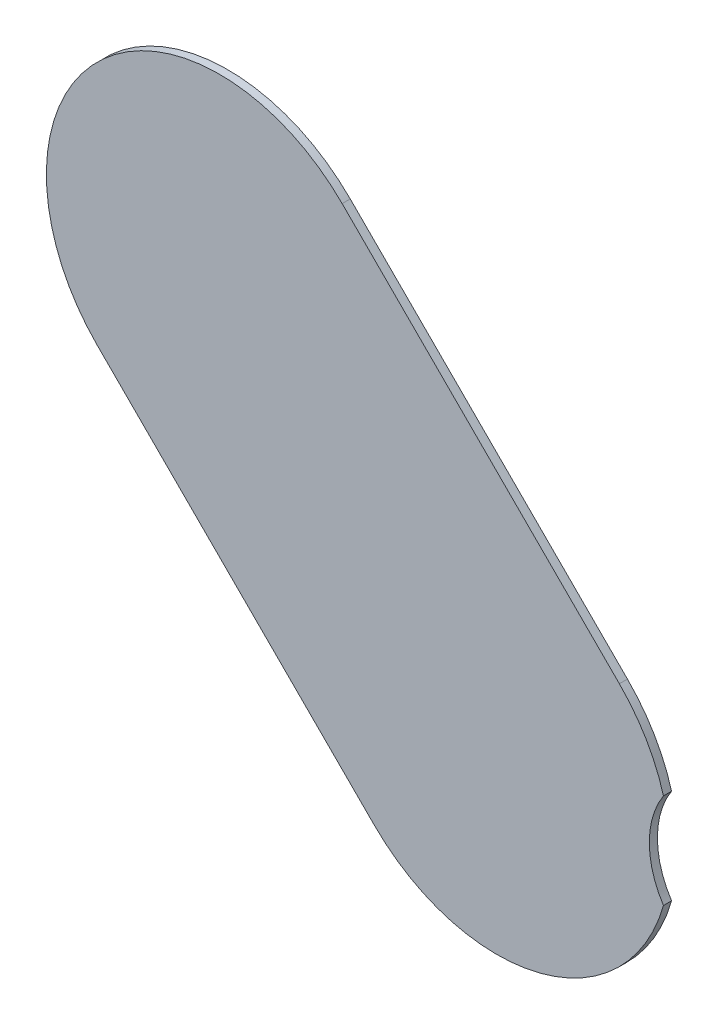
ISO-10303-21;
HEADER;
FILE_DESCRIPTION(('STEP AP214'),'2;1');
FILE_NAME('part.step','',(''),(''),'','','');
FILE_SCHEMA(('AUTOMOTIVE_DESIGN { 1 0 10303 214 1 1 1 1 }'));
ENDSEC;
DATA;
#1=APPLICATION_CONTEXT('core data for automotive mechanical design processes');
#2=APPLICATION_PROTOCOL_DEFINITION('international standard','automotive_design',2000,#1);
#3=PRODUCT_CONTEXT('',#1,'mechanical');
#4=PRODUCT('Part','Part','',(#3));
#5=PRODUCT_RELATED_PRODUCT_CATEGORY('part','',(#4));
#6=PRODUCT_DEFINITION_FORMATION('','',#4);
#7=PRODUCT_DEFINITION_CONTEXT('part definition',#1,'design');
#8=PRODUCT_DEFINITION('design','',#6,#7);
#9=PRODUCT_DEFINITION_SHAPE('','',#8);
#10=(LENGTH_UNIT() NAMED_UNIT(*) SI_UNIT(.MILLI.,.METRE.));
#11=(NAMED_UNIT(*) PLANE_ANGLE_UNIT() SI_UNIT($,.RADIAN.));
#12=(NAMED_UNIT(*) SI_UNIT($,.STERADIAN.) SOLID_ANGLE_UNIT());
#13=UNCERTAINTY_MEASURE_WITH_UNIT(LENGTH_MEASURE(1.E-05),#10,'distance_accuracy_value','');
#14=(GEOMETRIC_REPRESENTATION_CONTEXT(3) GLOBAL_UNCERTAINTY_ASSIGNED_CONTEXT((#13)) GLOBAL_UNIT_ASSIGNED_CONTEXT((#10,
#11,#12)) REPRESENTATION_CONTEXT('',''));
#15=CARTESIAN_POINT('',(0.,0.,0.));
#16=DIRECTION('',(0.,0.,1.));
#17=DIRECTION('',(1.,0.,0.));
#18=AXIS2_PLACEMENT_3D('',#15,#16,#17);
#19=CARTESIAN_POINT('',(20.4499995,-3.4499995,1.6));
#20=DIRECTION('',(0.,0.,-1.));
#21=DIRECTION('',(-0.707106781186548,-0.707106781186548,0.));
#22=AXIS2_PLACEMENT_3D('',#19,#20,#21);
#23=CYLINDRICAL_SURFACE('',#22,0.75000058564);
#24=DIRECTION('',(0.,0.,-1.));
#25=VECTOR('',#24,1.);
#26=CARTESIAN_POINT('',(21.171304324483,-3.655475115676,1.6));
#27=LINE('',#26,#25);
#28=CARTESIAN_POINT('',(21.171304324483,-3.655475115676,1.635));
#29=VERTEX_POINT('',#28);
#30=CARTESIAN_POINT('',(21.171304324483,-3.655475115676,1.6));
#31=VERTEX_POINT('',#30);
#32=EDGE_CURVE('E25',#29,#31,#27,.T.);
#33=ORIENTED_EDGE('',*,*,#32,.F.);
#34=CARTESIAN_POINT('',(20.4499995,-3.4499995,1.635));
#35=DIRECTION('',(0.,0.,1.));
#36=DIRECTION('',(-0.707106781186548,-0.707106781186548,0.));
#37=AXIS2_PLACEMENT_3D('',#34,#35,#36);
#38=CIRCLE('',#37,0.75000058564);
#39=CARTESIAN_POINT('',(19.919669,-3.98033,1.635));
#40=VERTEX_POINT('',#39);
#41=EDGE_CURVE('E142',#40,#29,#38,.T.);
#42=ORIENTED_EDGE('',*,*,#41,.F.);
#43=DIRECTION('',(0.,0.,1.));
#44=VECTOR('',#43,1.);
#45=CARTESIAN_POINT('',(19.919669,-3.98033,1.6));
#46=LINE('',#45,#44);
#47=CARTESIAN_POINT('',(19.919669,-3.98033,1.6));
#48=VERTEX_POINT('',#47);
#49=EDGE_CURVE('E11',#48,#40,#46,.T.);
#50=ORIENTED_EDGE('',*,*,#49,.F.);
#51=CARTESIAN_POINT('',(20.4499995,-3.4499995,1.6));
#52=DIRECTION('',(0.,0.,1.));
#53=DIRECTION('',(-0.707106781186548,-0.707106781186548,0.));
#54=AXIS2_PLACEMENT_3D('',#51,#52,#53);
#55=CIRCLE('',#54,0.75000058564);
#56=EDGE_CURVE('E144',#48,#31,#55,.T.);
#57=ORIENTED_EDGE('',*,*,#56,.T.);
#58=EDGE_LOOP('',(#33,#42,#50,#57));
#59=FACE_BOUND('',#58,.T.);
#60=ADVANCED_FACE('F16',(#59),#23,.T.);
#61=CARTESIAN_POINT('',(18.719669,-2.78033,1.6));
#62=DIRECTION('',(0.707106781186548,0.707106781186548,0.));
#63=DIRECTION('',(0.,0.,-1.));
#64=AXIS2_PLACEMENT_3D('',#61,#62,#63);
#65=PLANE('',#64);
#66=DIRECTION('',(0.707106781186548,-0.707106781186548,0.));
#67=VECTOR('',#66,1.);
#68=CARTESIAN_POINT('',(18.719669,-2.78033,1.6));
#69=LINE('',#68,#67);
#70=CARTESIAN_POINT('',(18.719669,-2.78033,1.6));
#71=VERTEX_POINT('',#70);
#72=EDGE_CURVE('E143',#71,#48,#69,.T.);
#73=ORIENTED_EDGE('',*,*,#72,.T.);
#74=ORIENTED_EDGE('',*,*,#49,.T.);
#75=DIRECTION('',(0.707106781186548,-0.707106781186548,0.));
#76=VECTOR('',#75,1.);
#77=CARTESIAN_POINT('',(18.719669,-2.78033,1.635));
#78=LINE('',#77,#76);
#79=CARTESIAN_POINT('',(18.719669,-2.78033,1.635));
#80=VERTEX_POINT('',#79);
#81=EDGE_CURVE('E139',#80,#40,#78,.T.);
#82=ORIENTED_EDGE('',*,*,#81,.F.);
#83=DIRECTION('',(0.,0.,1.));
#84=VECTOR('',#83,1.);
#85=CARTESIAN_POINT('',(18.719669,-2.78033,1.6));
#86=LINE('',#85,#84);
#87=EDGE_CURVE('E104',#71,#80,#86,.T.);
#88=ORIENTED_EDGE('',*,*,#87,.F.);
#89=EDGE_LOOP('',(#73,#74,#82,#88));
#90=FACE_BOUND('',#89,.T.);
#91=ADVANCED_FACE('F271',(#90),#65,.F.);
#92=CARTESIAN_POINT('',(21.485,-3.45,-0.045));
#93=DIRECTION('',(0.,0.,-1.));
#94=DIRECTION('',(0.,-1.,0.));
#95=AXIS2_PLACEMENT_3D('',#92,#93,#94);
#96=CYLINDRICAL_SURFACE('',#95,0.375);
#97=DIRECTION('',(0.,0.,-1.));
#98=VECTOR('',#97,1.);
#99=CARTESIAN_POINT('',(21.17130452301,-3.244524581236,1.6));
#100=LINE('',#99,#98);
#101=CARTESIAN_POINT('',(21.17130452301,-3.244524581237,1.635));
#102=VERTEX_POINT('',#101);
#103=CARTESIAN_POINT('',(21.17130452301,-3.244524581237,1.6));
#104=VERTEX_POINT('',#103);
#105=EDGE_CURVE('E132',#102,#104,#100,.T.);
#106=ORIENTED_EDGE('',*,*,#105,.F.);
#107=CARTESIAN_POINT('',(21.485,-3.45,1.635));
#108=DIRECTION('',(0.,0.,-1.));
#109=DIRECTION('',(0.,-1.,0.));
#110=AXIS2_PLACEMENT_3D('',#107,#108,#109);
#111=CIRCLE('',#110,0.375);
#112=EDGE_CURVE('E83',#29,#102,#111,.T.);
#113=ORIENTED_EDGE('',*,*,#112,.F.);
#114=ORIENTED_EDGE('',*,*,#32,.T.);
#115=CARTESIAN_POINT('',(21.485,-3.45,1.6));
#116=DIRECTION('',(0.,0.,-1.));
#117=DIRECTION('',(0.,-1.,0.));
#118=AXIS2_PLACEMENT_3D('',#115,#116,#117);
#119=CIRCLE('',#118,0.375);
#120=EDGE_CURVE('E70',#31,#104,#119,.T.);
#121=ORIENTED_EDGE('',*,*,#120,.T.);
#122=EDGE_LOOP('',(#106,#113,#114,#121));
#123=FACE_BOUND('',#122,.T.);
#124=ADVANCED_FACE('F262',(#123),#96,.F.);
#125=CARTESIAN_POINT('',(20.98033,-2.919669,1.635));
#126=DIRECTION('',(0.,0.,1.));
#127=DIRECTION('',(1.,0.,0.));
#128=AXIS2_PLACEMENT_3D('',#125,#126,#127);
#129=PLANE('',#128);
#130=CARTESIAN_POINT('',(20.4499995,-3.4499995,1.635));
#131=DIRECTION('',(0.,0.,1.));
#132=DIRECTION('',(-0.707106781186548,-0.707106781186548,0.));
#133=AXIS2_PLACEMENT_3D('',#130,#131,#132);
#134=CIRCLE('',#133,0.75000058564);
#135=CARTESIAN_POINT('',(20.98033,-2.919669,1.635));
#136=VERTEX_POINT('',#135);
#137=EDGE_CURVE('E112',#102,#136,#134,.T.);
#138=ORIENTED_EDGE('',*,*,#137,.T.);
#139=DIRECTION('',(-0.707106781186548,0.707106781186548,0.));
#140=VECTOR('',#139,1.);
#141=CARTESIAN_POINT('',(20.98033,-2.919669,1.635));
#142=LINE('',#141,#140);
#143=CARTESIAN_POINT('',(19.78033,-1.719669,1.635));
#144=VERTEX_POINT('',#143);
#145=EDGE_CURVE('E109',#136,#144,#142,.T.);
#146=ORIENTED_EDGE('',*,*,#145,.T.);
#147=CARTESIAN_POINT('',(19.2499995,-2.2499995,1.635));
#148=DIRECTION('',(0.,0.,1.));
#149=DIRECTION('',(0.707106781186548,0.707106781186548,0.));
#150=AXIS2_PLACEMENT_3D('',#147,#148,#149);
#151=CIRCLE('',#150,0.75000058564);
#152=EDGE_CURVE('E96',#144,#80,#151,.T.);
#153=ORIENTED_EDGE('',*,*,#152,.T.);
#154=ORIENTED_EDGE('',*,*,#81,.T.);
#155=ORIENTED_EDGE('',*,*,#41,.T.);
#156=ORIENTED_EDGE('',*,*,#112,.T.);
#157=EDGE_LOOP('',(#138,#146,#153,#154,#155,#156));
#158=FACE_BOUND('',#157,.T.);
#159=ADVANCED_FACE('F110',(#158),#129,.T.);
#160=CARTESIAN_POINT('',(20.98033,-2.919669,1.6));
#161=DIRECTION('',(0.,0.,1.));
#162=DIRECTION('',(1.,0.,0.));
#163=AXIS2_PLACEMENT_3D('',#160,#161,#162);
#164=PLANE('',#163);
#165=ORIENTED_EDGE('',*,*,#120,.F.);
#166=ORIENTED_EDGE('',*,*,#56,.F.);
#167=ORIENTED_EDGE('',*,*,#72,.F.);
#168=CARTESIAN_POINT('',(19.2499995,-2.2499995,1.6));
#169=DIRECTION('',(0.,0.,1.));
#170=DIRECTION('',(0.707106781186548,0.707106781186548,0.));
#171=AXIS2_PLACEMENT_3D('',#168,#169,#170);
#172=CIRCLE('',#171,0.75000058564);
#173=CARTESIAN_POINT('',(19.78033,-1.719669,1.6));
#174=VERTEX_POINT('',#173);
#175=EDGE_CURVE('E136',#174,#71,#172,.T.);
#176=ORIENTED_EDGE('',*,*,#175,.F.);
#177=DIRECTION('',(-0.707106781186548,0.707106781186548,0.));
#178=VECTOR('',#177,1.);
#179=CARTESIAN_POINT('',(20.98033,-2.919669,1.6));
#180=LINE('',#179,#178);
#181=CARTESIAN_POINT('',(20.98033,-2.919669,1.6));
#182=VERTEX_POINT('',#181);
#183=EDGE_CURVE('E121',#182,#174,#180,.T.);
#184=ORIENTED_EDGE('',*,*,#183,.F.);
#185=CARTESIAN_POINT('',(20.4499995,-3.4499995,1.6));
#186=DIRECTION('',(0.,0.,1.));
#187=DIRECTION('',(-0.707106781186548,-0.707106781186548,0.));
#188=AXIS2_PLACEMENT_3D('',#185,#186,#187);
#189=CIRCLE('',#188,0.75000058564);
#190=EDGE_CURVE('E19',#104,#182,#189,.T.);
#191=ORIENTED_EDGE('',*,*,#190,.F.);
#192=EDGE_LOOP('',(#165,#166,#167,#176,#184,#191));
#193=FACE_BOUND('',#192,.T.);
#194=ADVANCED_FACE('F243',(#193),#164,.F.);
#195=CARTESIAN_POINT('',(19.2499995,-2.2499995,1.6));
#196=DIRECTION('',(0.,0.,-1.));
#197=DIRECTION('',(0.707106781186548,0.707106781186548,0.));
#198=AXIS2_PLACEMENT_3D('',#195,#196,#197);
#199=CYLINDRICAL_SURFACE('',#198,0.75000058564);
#200=ORIENTED_EDGE('',*,*,#175,.T.);
#201=ORIENTED_EDGE('',*,*,#87,.T.);
#202=ORIENTED_EDGE('',*,*,#152,.F.);
#203=DIRECTION('',(0.,0.,1.));
#204=VECTOR('',#203,1.);
#205=CARTESIAN_POINT('',(19.78033,-1.719669,1.6));
#206=LINE('',#205,#204);
#207=EDGE_CURVE('E101',#174,#144,#206,.T.);
#208=ORIENTED_EDGE('',*,*,#207,.F.);
#209=EDGE_LOOP('',(#200,#201,#202,#208));
#210=FACE_BOUND('',#209,.T.);
#211=ADVANCED_FACE('F99',(#210),#199,.T.);
#212=CARTESIAN_POINT('',(20.4499995,-3.4499995,1.6));
#213=DIRECTION('',(0.,0.,-1.));
#214=DIRECTION('',(-0.707106781186548,-0.707106781186548,0.));
#215=AXIS2_PLACEMENT_3D('',#212,#213,#214);
#216=CYLINDRICAL_SURFACE('',#215,0.75000058564);
#217=DIRECTION('',(0.,0.,1.));
#218=VECTOR('',#217,1.);
#219=CARTESIAN_POINT('',(20.98033,-2.919669,1.6));
#220=LINE('',#219,#218);
#221=EDGE_CURVE('E117',#182,#136,#220,.T.);
#222=ORIENTED_EDGE('',*,*,#221,.T.);
#223=ORIENTED_EDGE('',*,*,#137,.F.);
#224=ORIENTED_EDGE('',*,*,#105,.T.);
#225=ORIENTED_EDGE('',*,*,#190,.T.);
#226=EDGE_LOOP('',(#222,#223,#224,#225));
#227=FACE_BOUND('',#226,.T.);
#228=ADVANCED_FACE('F220',(#227),#216,.T.);
#229=CARTESIAN_POINT('',(20.98033,-2.919669,1.6));
#230=DIRECTION('',(-0.707106781186548,-0.707106781186548,0.));
#231=DIRECTION('',(-0.707106781186548,0.707106781186548,0.));
#232=AXIS2_PLACEMENT_3D('',#229,#230,#231);
#233=PLANE('',#232);
#234=ORIENTED_EDGE('',*,*,#183,.T.);
#235=ORIENTED_EDGE('',*,*,#207,.T.);
#236=ORIENTED_EDGE('',*,*,#145,.F.);
#237=ORIENTED_EDGE('',*,*,#221,.F.);
#238=EDGE_LOOP('',(#234,#235,#236,#237));
#239=FACE_BOUND('',#238,.T.);
#240=ADVANCED_FACE('F119',(#239),#233,.F.);
#241=CLOSED_SHELL('',(#60,#91,#124,#159,#194,#211,#228,#240));
#242=MANIFOLD_SOLID_BREP('B1',#241);
#243=ADVANCED_BREP_SHAPE_REPRESENTATION('',(#18,#242),#14);
#244=SHAPE_DEFINITION_REPRESENTATION(#9,#243);
ENDSEC;
END-ISO-10303-21;
